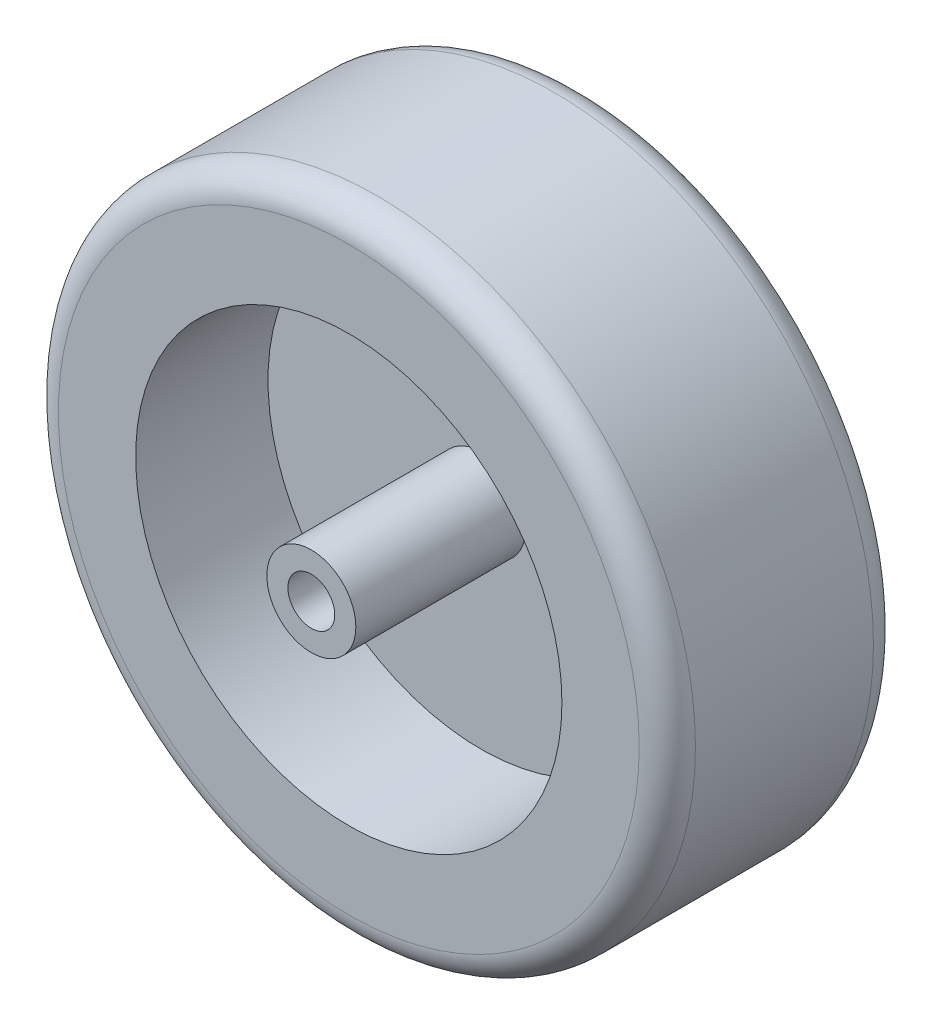
ISO-10303-21;
HEADER;
FILE_DESCRIPTION(('STEP AP214'),'2;1');
FILE_NAME('part.step','',(''),(''),'','','');
FILE_SCHEMA(('AUTOMOTIVE_DESIGN { 1 0 10303 214 1 1 1 1 }'));
ENDSEC;
DATA;
#1=APPLICATION_CONTEXT('core data for automotive mechanical design processes');
#2=APPLICATION_PROTOCOL_DEFINITION('international standard','automotive_design',2000,#1);
#3=PRODUCT_CONTEXT('',#1,'mechanical');
#4=PRODUCT('Part','Part','',(#3));
#5=PRODUCT_RELATED_PRODUCT_CATEGORY('part','',(#4));
#6=PRODUCT_DEFINITION_FORMATION('','',#4);
#7=PRODUCT_DEFINITION_CONTEXT('part definition',#1,'design');
#8=PRODUCT_DEFINITION('design','',#6,#7);
#9=PRODUCT_DEFINITION_SHAPE('','',#8);
#10=(LENGTH_UNIT() NAMED_UNIT(*) SI_UNIT(.MILLI.,.METRE.));
#11=(NAMED_UNIT(*) PLANE_ANGLE_UNIT() SI_UNIT($,.RADIAN.));
#12=(NAMED_UNIT(*) SI_UNIT($,.STERADIAN.) SOLID_ANGLE_UNIT());
#13=UNCERTAINTY_MEASURE_WITH_UNIT(LENGTH_MEASURE(1.E-05),#10,'distance_accuracy_value','');
#14=(GEOMETRIC_REPRESENTATION_CONTEXT(3) GLOBAL_UNCERTAINTY_ASSIGNED_CONTEXT((#13)) GLOBAL_UNIT_ASSIGNED_CONTEXT((#10,
#11,#12)) REPRESENTATION_CONTEXT('',''));
#15=CARTESIAN_POINT('',(0.,0.,0.));
#16=DIRECTION('',(0.,0.,1.));
#17=DIRECTION('',(1.,0.,0.));
#18=AXIS2_PLACEMENT_3D('',#15,#16,#17);
#19=CARTESIAN_POINT('',(4.75,0.,0.));
#20=DIRECTION('',(0.,0.,1.));
#21=DIRECTION('',(1.,0.,0.));
#22=AXIS2_PLACEMENT_3D('',#19,#20,#21);
#23=PLANE('',#22);
#24=CARTESIAN_POINT('',(0.,0.,0.));
#25=DIRECTION('',(0.,0.,1.));
#26=DIRECTION('',(1.,0.,0.));
#27=AXIS2_PLACEMENT_3D('',#24,#25,#26);
#28=CIRCLE('',#27,2.5);
#29=CARTESIAN_POINT('',(2.5,0.,0.));
#30=VERTEX_POINT('',#29);
#31=EDGE_CURVE('E78',#30,#30,#28,.T.);
#32=ORIENTED_EDGE('',*,*,#31,.F.);
#33=EDGE_LOOP('',(#32));
#34=FACE_BOUND('',#33,.T.);
#35=CARTESIAN_POINT('',(0.,0.,0.));
#36=DIRECTION('',(0.,0.,1.));
#37=DIRECTION('',(1.,0.,0.));
#38=AXIS2_PLACEMENT_3D('',#35,#36,#37);
#39=CIRCLE('',#38,4.75);
#40=CARTESIAN_POINT('',(4.75,0.,0.));
#41=VERTEX_POINT('',#40);
#42=EDGE_CURVE('E73',#41,#41,#39,.T.);
#43=ORIENTED_EDGE('',*,*,#42,.T.);
#44=EDGE_LOOP('',(#43));
#45=FACE_BOUND('',#44,.T.);
#46=ADVANCED_FACE('F37',(#34,#45),#23,.T.);
#47=CARTESIAN_POINT('',(0.,0.,-29.));
#48=DIRECTION('',(0.,0.,-1.));
#49=DIRECTION('',(-1.,0.,0.));
#50=AXIS2_PLACEMENT_3D('',#47,#48,#49);
#51=PLANE('',#50);
#52=CARTESIAN_POINT('',(0.,0.,-29.));
#53=DIRECTION('',(0.,0.,-1.));
#54=DIRECTION('',(-1.,0.,0.));
#55=AXIS2_PLACEMENT_3D('',#52,#53,#54);
#56=CIRCLE('',#55,31.);
#57=CARTESIAN_POINT('',(-31.,0.,-29.));
#58=VERTEX_POINT('',#57);
#59=EDGE_CURVE('E10',#58,#58,#56,.T.);
#60=ORIENTED_EDGE('',*,*,#59,.T.);
#61=EDGE_LOOP('',(#60));
#62=FACE_BOUND('',#61,.T.);
#63=ADVANCED_FACE('F96',(#62),#51,.T.);
#64=CARTESIAN_POINT('',(0.,0.,0.));
#65=DIRECTION('',(0.,0.,1.));
#66=DIRECTION('',(1.,0.,0.));
#67=AXIS2_PLACEMENT_3D('',#64,#65,#66);
#68=CYLINDRICAL_SURFACE('',#67,34.);
#69=CARTESIAN_POINT('',(0.,0.,-7.));
#70=DIRECTION('',(0.,0.,1.));
#71=DIRECTION('',(1.,0.,0.));
#72=AXIS2_PLACEMENT_3D('',#69,#70,#71);
#73=CIRCLE('',#72,34.);
#74=CARTESIAN_POINT('',(34.,0.,-7.));
#75=VERTEX_POINT('',#74);
#76=EDGE_CURVE('E45',#75,#75,#73,.F.);
#77=ORIENTED_EDGE('',*,*,#76,.T.);
#78=EDGE_LOOP('',(#77));
#79=FACE_BOUND('',#78,.T.);
#80=CARTESIAN_POINT('',(0.,0.,-26.));
#81=DIRECTION('',(0.,0.,-1.));
#82=DIRECTION('',(-1.,0.,0.));
#83=AXIS2_PLACEMENT_3D('',#80,#81,#82);
#84=CIRCLE('',#83,34.);
#85=CARTESIAN_POINT('',(-34.,0.,-26.));
#86=VERTEX_POINT('',#85);
#87=EDGE_CURVE('E50',#86,#86,#84,.F.);
#88=ORIENTED_EDGE('',*,*,#87,.T.);
#89=EDGE_LOOP('',(#88));
#90=FACE_BOUND('',#89,.T.);
#91=ADVANCED_FACE('F122',(#79,#90),#68,.T.);
#92=CARTESIAN_POINT('',(34.,0.,-4.));
#93=DIRECTION('',(0.,0.,1.));
#94=DIRECTION('',(1.,0.,0.));
#95=AXIS2_PLACEMENT_3D('',#92,#93,#94);
#96=PLANE('',#95);
#97=CARTESIAN_POINT('',(0.,0.,-4.));
#98=DIRECTION('',(0.,0.,1.));
#99=DIRECTION('',(1.,0.,0.));
#100=AXIS2_PLACEMENT_3D('',#97,#98,#99);
#101=CIRCLE('',#100,31.);
#102=CARTESIAN_POINT('',(31.,0.,-4.));
#103=VERTEX_POINT('',#102);
#104=EDGE_CURVE('E55',#103,#103,#101,.T.);
#105=ORIENTED_EDGE('',*,*,#104,.T.);
#106=EDGE_LOOP('',(#105));
#107=FACE_BOUND('',#106,.T.);
#108=CARTESIAN_POINT('',(0.,0.,-4.));
#109=DIRECTION('',(0.,0.,1.));
#110=DIRECTION('',(1.,0.,0.));
#111=AXIS2_PLACEMENT_3D('',#108,#109,#110);
#112=CIRCLE('',#111,22.75);
#113=CARTESIAN_POINT('',(22.75,0.,-4.));
#114=VERTEX_POINT('',#113);
#115=EDGE_CURVE('E61',#114,#114,#112,.T.);
#116=ORIENTED_EDGE('',*,*,#115,.F.);
#117=EDGE_LOOP('',(#116));
#118=FACE_BOUND('',#117,.T.);
#119=ADVANCED_FACE('F118',(#107,#118),#96,.T.);
#120=CARTESIAN_POINT('',(0.,0.,0.));
#121=DIRECTION('',(0.,0.,1.));
#122=DIRECTION('',(1.,0.,0.));
#123=AXIS2_PLACEMENT_3D('',#120,#121,#122);
#124=CYLINDRICAL_SURFACE('',#123,22.75);
#125=ORIENTED_EDGE('',*,*,#115,.T.);
#126=EDGE_LOOP('',(#125));
#127=FACE_BOUND('',#126,.T.);
#128=CARTESIAN_POINT('',(0.,0.,-18.125));
#129=DIRECTION('',(0.,0.,1.));
#130=DIRECTION('',(1.,0.,0.));
#131=AXIS2_PLACEMENT_3D('',#128,#129,#130);
#132=CIRCLE('',#131,22.75);
#133=CARTESIAN_POINT('',(22.75,0.,-18.125));
#134=VERTEX_POINT('',#133);
#135=EDGE_CURVE('E65',#134,#134,#132,.T.);
#136=ORIENTED_EDGE('',*,*,#135,.F.);
#137=EDGE_LOOP('',(#136));
#138=FACE_BOUND('',#137,.T.);
#139=ADVANCED_FACE('F111',(#127,#138),#124,.F.);
#140=CARTESIAN_POINT('',(22.75,0.,-18.125));
#141=DIRECTION('',(0.,0.,1.));
#142=DIRECTION('',(1.,0.,0.));
#143=AXIS2_PLACEMENT_3D('',#140,#141,#142);
#144=PLANE('',#143);
#145=ORIENTED_EDGE('',*,*,#135,.T.);
#146=EDGE_LOOP('',(#145));
#147=FACE_BOUND('',#146,.T.);
#148=CARTESIAN_POINT('',(0.,0.,-18.125));
#149=DIRECTION('',(0.,0.,1.));
#150=DIRECTION('',(1.,0.,0.));
#151=AXIS2_PLACEMENT_3D('',#148,#149,#150);
#152=CIRCLE('',#151,4.75);
#153=CARTESIAN_POINT('',(4.75,0.,-18.125));
#154=VERTEX_POINT('',#153);
#155=EDGE_CURVE('E69',#154,#154,#152,.T.);
#156=ORIENTED_EDGE('',*,*,#155,.F.);
#157=EDGE_LOOP('',(#156));
#158=FACE_BOUND('',#157,.T.);
#159=ADVANCED_FACE('F103',(#147,#158),#144,.T.);
#160=CARTESIAN_POINT('',(0.,0.,0.));
#161=DIRECTION('',(0.,0.,1.));
#162=DIRECTION('',(1.,0.,0.));
#163=AXIS2_PLACEMENT_3D('',#160,#161,#162);
#164=CYLINDRICAL_SURFACE('',#163,4.75);
#165=ORIENTED_EDGE('',*,*,#155,.T.);
#166=EDGE_LOOP('',(#165));
#167=FACE_BOUND('',#166,.T.);
#168=ORIENTED_EDGE('',*,*,#42,.F.);
#169=EDGE_LOOP('',(#168));
#170=FACE_BOUND('',#169,.T.);
#171=ADVANCED_FACE('F100',(#167,#170),#164,.T.);
#172=CARTESIAN_POINT('',(0.,0.,-7.));
#173=DIRECTION('',(0.,0.,1.));
#174=DIRECTION('',(1.,0.,0.));
#175=AXIS2_PLACEMENT_3D('',#172,#173,#174);
#176=TOROIDAL_SURFACE('',#175,31.,3.);
#177=ORIENTED_EDGE('',*,*,#76,.F.);
#178=EDGE_LOOP('',(#177));
#179=FACE_BOUND('',#178,.T.);
#180=ORIENTED_EDGE('',*,*,#104,.F.);
#181=EDGE_LOOP('',(#180));
#182=FACE_BOUND('',#181,.T.);
#183=ADVANCED_FACE('F102',(#179,#182),#176,.T.);
#184=CARTESIAN_POINT('',(0.,0.,-26.));
#185=DIRECTION('',(0.,0.,-1.));
#186=DIRECTION('',(-1.,0.,0.));
#187=AXIS2_PLACEMENT_3D('',#184,#185,#186);
#188=TOROIDAL_SURFACE('',#187,31.,3.);
#189=ORIENTED_EDGE('',*,*,#59,.F.);
#190=EDGE_LOOP('',(#189));
#191=FACE_BOUND('',#190,.T.);
#192=ORIENTED_EDGE('',*,*,#87,.F.);
#193=EDGE_LOOP('',(#192));
#194=FACE_BOUND('',#193,.T.);
#195=ADVANCED_FACE('F39',(#191,#194),#188,.T.);
#196=CARTESIAN_POINT('',(0.,0.,-10.));
#197=DIRECTION('',(0.,0.,1.));
#198=DIRECTION('',(1.,0.,0.));
#199=AXIS2_PLACEMENT_3D('',#196,#197,#198);
#200=CYLINDRICAL_SURFACE('',#199,2.5);
#201=CARTESIAN_POINT('',(0.,0.,-10.));
#202=DIRECTION('',(0.,0.,1.));
#203=DIRECTION('',(1.,0.,0.));
#204=AXIS2_PLACEMENT_3D('',#201,#202,#203);
#205=CIRCLE('',#204,2.5);
#206=CARTESIAN_POINT('',(2.5,0.,-10.));
#207=VERTEX_POINT('',#206);
#208=EDGE_CURVE('E77',#207,#207,#205,.T.);
#209=ORIENTED_EDGE('',*,*,#208,.F.);
#210=EDGE_LOOP('',(#209));
#211=FACE_BOUND('',#210,.T.);
#212=ORIENTED_EDGE('',*,*,#31,.T.);
#213=EDGE_LOOP('',(#212));
#214=FACE_BOUND('',#213,.T.);
#215=ADVANCED_FACE('F88',(#211,#214),#200,.F.);
#216=CARTESIAN_POINT('',(0.,0.,-10.));
#217=DIRECTION('',(0.,0.,1.));
#218=DIRECTION('',(1.,0.,0.));
#219=AXIS2_PLACEMENT_3D('',#216,#217,#218);
#220=PLANE('',#219);
#221=ORIENTED_EDGE('',*,*,#208,.T.);
#222=EDGE_LOOP('',(#221));
#223=FACE_BOUND('',#222,.T.);
#224=ADVANCED_FACE('F86',(#223),#220,.T.);
#225=CLOSED_SHELL('',(#46,#63,#91,#119,#139,#159,#171,#183,#195,#215,#224));
#226=MANIFOLD_SOLID_BREP('B2',#225);
#227=ADVANCED_BREP_SHAPE_REPRESENTATION('',(#18,#226),#14);
#228=SHAPE_DEFINITION_REPRESENTATION(#9,#227);
ENDSEC;
END-ISO-10303-21;
